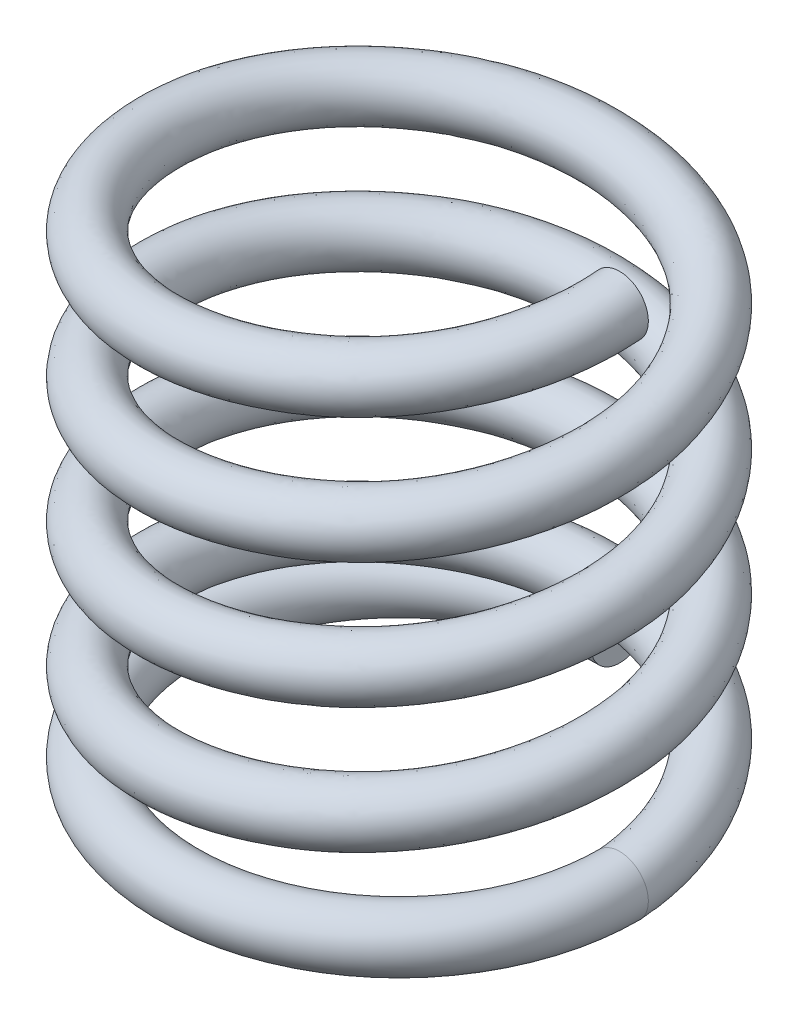
ISO-10303-21;
HEADER;
FILE_DESCRIPTION(('STEP AP214'),'2;1');
FILE_NAME('part.step','',(''),(''),'','','');
FILE_SCHEMA(('AUTOMOTIVE_DESIGN { 1 0 10303 214 1 1 1 1 }'));
ENDSEC;
DATA;
#1=APPLICATION_CONTEXT('core data for automotive mechanical design processes');
#2=APPLICATION_PROTOCOL_DEFINITION('international standard','automotive_design',2000,#1);
#3=PRODUCT_CONTEXT('',#1,'mechanical');
#4=PRODUCT('Part','Part','',(#3));
#5=PRODUCT_RELATED_PRODUCT_CATEGORY('part','',(#4));
#6=PRODUCT_DEFINITION_FORMATION('','',#4);
#7=PRODUCT_DEFINITION_CONTEXT('part definition',#1,'design');
#8=PRODUCT_DEFINITION('design','',#6,#7);
#9=PRODUCT_DEFINITION_SHAPE('','',#8);
#10=(LENGTH_UNIT() NAMED_UNIT(*) SI_UNIT(.MILLI.,.METRE.));
#11=(NAMED_UNIT(*) PLANE_ANGLE_UNIT() SI_UNIT($,.RADIAN.));
#12=(NAMED_UNIT(*) SI_UNIT($,.STERADIAN.) SOLID_ANGLE_UNIT());
#13=UNCERTAINTY_MEASURE_WITH_UNIT(LENGTH_MEASURE(1.E-05),#10,'distance_accuracy_value','');
#14=(GEOMETRIC_REPRESENTATION_CONTEXT(3) GLOBAL_UNCERTAINTY_ASSIGNED_CONTEXT((#13)) GLOBAL_UNIT_ASSIGNED_CONTEXT((#10,
#11,#12)) REPRESENTATION_CONTEXT('',''));
#15=CARTESIAN_POINT('',(0.,0.,0.));
#16=DIRECTION('',(0.,0.,1.));
#17=DIRECTION('',(1.,0.,0.));
#18=AXIS2_PLACEMENT_3D('',#15,#16,#17);
#19=CARTESIAN_POINT('',(3.302,0.,0.));
#20=CARTESIAN_POINT('',(3.302,0.138586516549963,-1.90641058886414));
#21=CARTESIAN_POINT('',(1.651,0.277173033099925,-2.85961588329622));
#22=CARTESIAN_POINT('',(0.,0.415759549649887,-3.81282117772829));
#23=CARTESIAN_POINT('',(-1.651,0.55434606619985,-2.85961588329622));
#24=CARTESIAN_POINT('',(-3.302,0.692932582749813,-1.90641058886415));
#25=CARTESIAN_POINT('',(-3.302,0.831519099299775,0.));
#26=CARTESIAN_POINT('',(-3.302,0.970105615849738,1.90641058886414));
#27=CARTESIAN_POINT('',(-1.651,1.1086921323997,2.85961588329622));
#28=CARTESIAN_POINT('',(0.,1.24727864894966,3.81282117772829));
#29=CARTESIAN_POINT('',(1.651,1.38586516549963,2.85961588329622));
#30=CARTESIAN_POINT('',(3.302,1.52445168204959,1.90641058886415));
#31=CARTESIAN_POINT('',(3.302,1.66303819859955,0.));
#32=CARTESIAN_POINT('',(3.302,1.80162471514951,-1.90641058886414));
#33=CARTESIAN_POINT('',(1.651,1.94021123169948,-2.85961588329622));
#34=CARTESIAN_POINT('',(0.,2.07879774824944,-3.81282117772829));
#35=CARTESIAN_POINT('',(-1.651,2.2173842647994,-2.85961588329622));
#36=CARTESIAN_POINT('',(-3.302,2.35597078134936,-1.90641058886415));
#37=CARTESIAN_POINT('',(-3.302,2.49455729789933,0.));
#38=CARTESIAN_POINT('',(-3.302,2.63314381444929,1.90641058886414));
#39=CARTESIAN_POINT('',(-1.651,2.77173033099925,2.85961588329622));
#40=CARTESIAN_POINT('',(0.,2.91031684754921,3.81282117772829));
#41=CARTESIAN_POINT('',(1.651,3.04890336409918,2.85961588329622));
#42=CARTESIAN_POINT('',(3.302,3.18748988064914,1.90641058886415));
#43=CARTESIAN_POINT('',(3.302,3.3260763971991,0.));
#44=CARTESIAN_POINT('',(3.302,3.46466291374906,-1.90641058886414));
#45=CARTESIAN_POINT('',(1.651,3.60324943029902,-2.85961588329622));
#46=CARTESIAN_POINT('',(0.,3.74183594684899,-3.81282117772829));
#47=CARTESIAN_POINT('',(-1.651,3.88042246339895,-2.85961588329622));
#48=CARTESIAN_POINT('',(-3.302,4.01900897994891,-1.90641058886415));
#49=CARTESIAN_POINT('',(-3.302,4.15759549649887,0.));
#50=CARTESIAN_POINT('',(-3.302,4.29618201304884,1.90641058886414));
#51=CARTESIAN_POINT('',(-1.651,4.4347685295988,2.85961588329622));
#52=CARTESIAN_POINT('',(0.,4.57335504614876,3.81282117772829));
#53=CARTESIAN_POINT('',(1.651,4.71194156269873,2.85961588329622));
#54=CARTESIAN_POINT('',(3.302,4.85052807924869,1.90641058886415));
#55=CARTESIAN_POINT('',(3.302,4.98911459579865,0.));
#56=CARTESIAN_POINT('',(3.302,5.12770111234861,-1.90641058886414));
#57=CARTESIAN_POINT('',(1.651,5.26628762889858,-2.85961588329622));
#58=CARTESIAN_POINT('',(0.,5.40487414544854,-3.81282117772829));
#59=CARTESIAN_POINT('',(-1.651,5.5434606619985,-2.85961588329622));
#60=CARTESIAN_POINT('',(-3.302,5.68204717854846,-1.90641058886415));
#61=CARTESIAN_POINT('',(-3.302,5.82063369509842,0.));
#62=CARTESIAN_POINT('',(-3.302,5.95922021164839,1.90641058886414));
#63=CARTESIAN_POINT('',(-1.651,6.09780672819835,2.85961588329622));
#64=CARTESIAN_POINT('',(0.,6.23639324474831,3.81282117772829));
#65=CARTESIAN_POINT('',(1.651,6.37497976129828,2.85961588329622));
#66=CARTESIAN_POINT('',(3.302,6.51356627784824,1.90641058886415));
#67=CARTESIAN_POINT('',(3.302,6.6521527943982,0.));
#68=CARTESIAN_POINT('',(3.302,0.761999999999999,0.));
#69=CARTESIAN_POINT('',(3.302,0.900586516549962,-1.90641058886414));
#70=CARTESIAN_POINT('',(1.651,1.03917303309992,-2.85961588329622));
#71=CARTESIAN_POINT('',(0.,1.17775954964989,-3.81282117772829));
#72=CARTESIAN_POINT('',(-1.651,1.31634606619985,-2.85961588329622));
#73=CARTESIAN_POINT('',(-3.302,1.45493258274981,-1.90641058886415));
#74=CARTESIAN_POINT('',(-3.302,1.59351909929977,0.));
#75=CARTESIAN_POINT('',(-3.302,1.73210561584974,1.90641058886414));
#76=CARTESIAN_POINT('',(-1.651,1.8706921323997,2.85961588329622));
#77=CARTESIAN_POINT('',(0.,2.00927864894966,3.81282117772829));
#78=CARTESIAN_POINT('',(1.651,2.14786516549962,2.85961588329622));
#79=CARTESIAN_POINT('',(3.302,2.28645168204959,1.90641058886415));
#80=CARTESIAN_POINT('',(3.302,2.42503819859955,0.));
#81=CARTESIAN_POINT('',(3.302,2.56362471514951,-1.90641058886414));
#82=CARTESIAN_POINT('',(1.651,2.70221123169947,-2.85961588329622));
#83=CARTESIAN_POINT('',(0.,2.84079774824944,-3.81282117772829));
#84=CARTESIAN_POINT('',(-1.651,2.9793842647994,-2.85961588329622));
#85=CARTESIAN_POINT('',(-3.302,3.11797078134936,-1.90641058886415));
#86=CARTESIAN_POINT('',(-3.302,3.25655729789932,0.));
#87=CARTESIAN_POINT('',(-3.302,3.39514381444929,1.90641058886414));
#88=CARTESIAN_POINT('',(-1.651,3.53373033099925,2.85961588329622));
#89=CARTESIAN_POINT('',(0.,3.67231684754921,3.81282117772829));
#90=CARTESIAN_POINT('',(1.651,3.81090336409917,2.85961588329622));
#91=CARTESIAN_POINT('',(3.302,3.94948988064914,1.90641058886415));
#92=CARTESIAN_POINT('',(3.302,4.0880763971991,0.));
#93=CARTESIAN_POINT('',(3.302,4.22666291374906,-1.90641058886414));
#94=CARTESIAN_POINT('',(1.651,4.36524943029902,-2.85961588329622));
#95=CARTESIAN_POINT('',(0.,4.50383594684899,-3.81282117772829));
#96=CARTESIAN_POINT('',(-1.651,4.64242246339895,-2.85961588329622));
#97=CARTESIAN_POINT('',(-3.302,4.78100897994891,-1.90641058886415));
#98=CARTESIAN_POINT('',(-3.302,4.91959549649888,0.));
#99=CARTESIAN_POINT('',(-3.302,5.05818201304884,1.90641058886414));
#100=CARTESIAN_POINT('',(-1.651,5.1967685295988,2.85961588329622));
#101=CARTESIAN_POINT('',(0.,5.33535504614876,3.81282117772829));
#102=CARTESIAN_POINT('',(1.651,5.47394156269872,2.85961588329622));
#103=CARTESIAN_POINT('',(3.302,5.61252807924869,1.90641058886415));
#104=CARTESIAN_POINT('',(3.302,5.75111459579865,0.));
#105=CARTESIAN_POINT('',(3.302,5.88970111234861,-1.90641058886414));
#106=CARTESIAN_POINT('',(1.651,6.02828762889857,-2.85961588329622));
#107=CARTESIAN_POINT('',(0.,6.16687414544854,-3.81282117772829));
#108=CARTESIAN_POINT('',(-1.651,6.3054606619985,-2.85961588329622));
#109=CARTESIAN_POINT('',(-3.302,6.44404717854846,-1.90641058886415));
#110=CARTESIAN_POINT('',(-3.302,6.58263369509843,0.));
#111=CARTESIAN_POINT('',(-3.302,6.72122021164839,1.90641058886414));
#112=CARTESIAN_POINT('',(-1.651,6.85980672819835,2.85961588329622));
#113=CARTESIAN_POINT('',(0.,6.99839324474831,3.81282117772829));
#114=CARTESIAN_POINT('',(1.651,7.13697976129828,2.85961588329622));
#115=CARTESIAN_POINT('',(3.302,7.27556627784824,1.90641058886415));
#116=CARTESIAN_POINT('',(3.302,7.4141527943982,0.));
#117=CARTESIAN_POINT('',(2.54,0.761999999999999,0.));
#118=CARTESIAN_POINT('',(2.54,0.900586516549962,-1.46646968374165));
#119=CARTESIAN_POINT('',(1.27,1.03917303309992,-2.19970452561247));
#120=CARTESIAN_POINT('',(0.,1.17775954964989,-2.9329393674833));
#121=CARTESIAN_POINT('',(-1.27,1.31634606619985,-2.19970452561247));
#122=CARTESIAN_POINT('',(-2.54,1.45493258274981,-1.46646968374165));
#123=CARTESIAN_POINT('',(-2.54,1.59351909929977,0.));
#124=CARTESIAN_POINT('',(-2.54,1.73210561584974,1.46646968374165));
#125=CARTESIAN_POINT('',(-1.27,1.8706921323997,2.19970452561247));
#126=CARTESIAN_POINT('',(0.,2.00927864894966,2.9329393674833));
#127=CARTESIAN_POINT('',(1.27,2.14786516549962,2.19970452561248));
#128=CARTESIAN_POINT('',(2.54,2.28645168204959,1.46646968374165));
#129=CARTESIAN_POINT('',(2.54,2.42503819859955,0.));
#130=CARTESIAN_POINT('',(2.54,2.56362471514951,-1.46646968374165));
#131=CARTESIAN_POINT('',(1.27,2.70221123169947,-2.19970452561247));
#132=CARTESIAN_POINT('',(0.,2.84079774824944,-2.9329393674833));
#133=CARTESIAN_POINT('',(-1.27,2.9793842647994,-2.19970452561247));
#134=CARTESIAN_POINT('',(-2.54,3.11797078134936,-1.46646968374165));
#135=CARTESIAN_POINT('',(-2.54,3.25655729789932,0.));
#136=CARTESIAN_POINT('',(-2.54,3.39514381444929,1.46646968374165));
#137=CARTESIAN_POINT('',(-1.27,3.53373033099925,2.19970452561247));
#138=CARTESIAN_POINT('',(0.,3.67231684754921,2.9329393674833));
#139=CARTESIAN_POINT('',(1.27,3.81090336409917,2.19970452561248));
#140=CARTESIAN_POINT('',(2.54,3.94948988064914,1.46646968374165));
#141=CARTESIAN_POINT('',(2.54,4.0880763971991,0.));
#142=CARTESIAN_POINT('',(2.54,4.22666291374906,-1.46646968374165));
#143=CARTESIAN_POINT('',(1.27,4.36524943029902,-2.19970452561247));
#144=CARTESIAN_POINT('',(0.,4.50383594684899,-2.9329393674833));
#145=CARTESIAN_POINT('',(-1.27,4.64242246339895,-2.19970452561247));
#146=CARTESIAN_POINT('',(-2.54,4.78100897994891,-1.46646968374165));
#147=CARTESIAN_POINT('',(-2.54,4.91959549649888,0.));
#148=CARTESIAN_POINT('',(-2.54,5.05818201304884,1.46646968374165));
#149=CARTESIAN_POINT('',(-1.27,5.1967685295988,2.19970452561247));
#150=CARTESIAN_POINT('',(0.,5.33535504614876,2.9329393674833));
#151=CARTESIAN_POINT('',(1.27,5.47394156269872,2.19970452561248));
#152=CARTESIAN_POINT('',(2.54,5.61252807924869,1.46646968374165));
#153=CARTESIAN_POINT('',(2.54,5.75111459579865,0.));
#154=CARTESIAN_POINT('',(2.54,5.88970111234861,-1.46646968374165));
#155=CARTESIAN_POINT('',(1.27,6.02828762889857,-2.19970452561247));
#156=CARTESIAN_POINT('',(0.,6.16687414544854,-2.9329393674833));
#157=CARTESIAN_POINT('',(-1.27,6.3054606619985,-2.19970452561247));
#158=CARTESIAN_POINT('',(-2.54,6.44404717854846,-1.46646968374165));
#159=CARTESIAN_POINT('',(-2.54,6.58263369509843,0.));
#160=CARTESIAN_POINT('',(-2.54,6.72122021164839,1.46646968374165));
#161=CARTESIAN_POINT('',(-1.27,6.85980672819835,2.19970452561247));
#162=CARTESIAN_POINT('',(0.,6.99839324474831,2.9329393674833));
#163=CARTESIAN_POINT('',(1.27,7.13697976129828,2.19970452561248));
#164=CARTESIAN_POINT('',(2.54,7.27556627784824,1.46646968374165));
#165=CARTESIAN_POINT('',(2.54,7.4141527943982,0.));
#166=CARTESIAN_POINT('',(2.54,0.,0.));
#167=CARTESIAN_POINT('',(2.54,0.138586516549963,-1.46646968374165));
#168=CARTESIAN_POINT('',(1.27,0.277173033099925,-2.19970452561247));
#169=CARTESIAN_POINT('',(0.,0.415759549649888,-2.9329393674833));
#170=CARTESIAN_POINT('',(-1.27,0.55434606619985,-2.19970452561247));
#171=CARTESIAN_POINT('',(-2.54,0.692932582749813,-1.46646968374165));
#172=CARTESIAN_POINT('',(-2.54,0.831519099299775,0.));
#173=CARTESIAN_POINT('',(-2.54,0.970105615849738,1.46646968374165));
#174=CARTESIAN_POINT('',(-1.27,1.1086921323997,2.19970452561247));
#175=CARTESIAN_POINT('',(0.,1.24727864894966,2.9329393674833));
#176=CARTESIAN_POINT('',(1.27,1.38586516549963,2.19970452561248));
#177=CARTESIAN_POINT('',(2.54,1.52445168204959,1.46646968374165));
#178=CARTESIAN_POINT('',(2.54,1.66303819859955,0.));
#179=CARTESIAN_POINT('',(2.54,1.80162471514951,-1.46646968374165));
#180=CARTESIAN_POINT('',(1.27,1.94021123169948,-2.19970452561247));
#181=CARTESIAN_POINT('',(0.,2.07879774824944,-2.9329393674833));
#182=CARTESIAN_POINT('',(-1.27,2.2173842647994,-2.19970452561247));
#183=CARTESIAN_POINT('',(-2.54,2.35597078134936,-1.46646968374165));
#184=CARTESIAN_POINT('',(-2.54,2.49455729789933,0.));
#185=CARTESIAN_POINT('',(-2.54,2.63314381444929,1.46646968374165));
#186=CARTESIAN_POINT('',(-1.27,2.77173033099925,2.19970452561247));
#187=CARTESIAN_POINT('',(0.,2.91031684754921,2.9329393674833));
#188=CARTESIAN_POINT('',(1.27,3.04890336409918,2.19970452561248));
#189=CARTESIAN_POINT('',(2.54,3.18748988064914,1.46646968374165));
#190=CARTESIAN_POINT('',(2.54,3.3260763971991,0.));
#191=CARTESIAN_POINT('',(2.54,3.46466291374906,-1.46646968374165));
#192=CARTESIAN_POINT('',(1.27,3.60324943029902,-2.19970452561247));
#193=CARTESIAN_POINT('',(0.,3.74183594684899,-2.9329393674833));
#194=CARTESIAN_POINT('',(-1.27,3.88042246339895,-2.19970452561247));
#195=CARTESIAN_POINT('',(-2.54,4.01900897994891,-1.46646968374165));
#196=CARTESIAN_POINT('',(-2.54,4.15759549649887,0.));
#197=CARTESIAN_POINT('',(-2.54,4.29618201304884,1.46646968374165));
#198=CARTESIAN_POINT('',(-1.27,4.4347685295988,2.19970452561247));
#199=CARTESIAN_POINT('',(0.,4.57335504614876,2.9329393674833));
#200=CARTESIAN_POINT('',(1.27,4.71194156269873,2.19970452561248));
#201=CARTESIAN_POINT('',(2.54,4.85052807924869,1.46646968374165));
#202=CARTESIAN_POINT('',(2.54,4.98911459579865,0.));
#203=CARTESIAN_POINT('',(2.54,5.12770111234861,-1.46646968374165));
#204=CARTESIAN_POINT('',(1.27,5.26628762889858,-2.19970452561247));
#205=CARTESIAN_POINT('',(0.,5.40487414544854,-2.9329393674833));
#206=CARTESIAN_POINT('',(-1.27,5.5434606619985,-2.19970452561247));
#207=CARTESIAN_POINT('',(-2.54,5.68204717854846,-1.46646968374165));
#208=CARTESIAN_POINT('',(-2.54,5.82063369509842,0.));
#209=CARTESIAN_POINT('',(-2.54,5.95922021164839,1.46646968374165));
#210=CARTESIAN_POINT('',(-1.27,6.09780672819835,2.19970452561247));
#211=CARTESIAN_POINT('',(0.,6.23639324474831,2.9329393674833));
#212=CARTESIAN_POINT('',(1.27,6.37497976129828,2.19970452561248));
#213=CARTESIAN_POINT('',(2.54,6.51356627784824,1.46646968374165));
#214=CARTESIAN_POINT('',(2.54,6.6521527943982,0.));
#215=CARTESIAN_POINT('',(2.54,-0.761999999999999,0.));
#216=CARTESIAN_POINT('',(2.54,-0.623413483450037,-1.46646968374165));
#217=CARTESIAN_POINT('',(1.27,-0.484826966900074,-2.19970452561247));
#218=CARTESIAN_POINT('',(0.,-0.346240450350112,-2.9329393674833));
#219=CARTESIAN_POINT('',(-1.27,-0.207653933800149,-2.19970452561247));
#220=CARTESIAN_POINT('',(-2.54,-0.0690674172501869,-1.46646968374165));
#221=CARTESIAN_POINT('',(-2.54,0.0695190992997755,0.));
#222=CARTESIAN_POINT('',(-2.54,0.208105615849738,1.46646968374165));
#223=CARTESIAN_POINT('',(-1.27,0.346692132399701,2.19970452561247));
#224=CARTESIAN_POINT('',(0.,0.485278648949663,2.9329393674833));
#225=CARTESIAN_POINT('',(1.27,0.623865165499626,2.19970452561248));
#226=CARTESIAN_POINT('',(2.54,0.762451682049588,1.46646968374165));
#227=CARTESIAN_POINT('',(2.54,0.90103819859955,0.));
#228=CARTESIAN_POINT('',(2.54,1.03962471514951,-1.46646968374165));
#229=CARTESIAN_POINT('',(1.27,1.17821123169948,-2.19970452561247));
#230=CARTESIAN_POINT('',(0.,1.31679774824944,-2.9329393674833));
#231=CARTESIAN_POINT('',(-1.27,1.4553842647994,-2.19970452561247));
#232=CARTESIAN_POINT('',(-2.54,1.59397078134936,-1.46646968374165));
#233=CARTESIAN_POINT('',(-2.54,1.73255729789933,0.));
#234=CARTESIAN_POINT('',(-2.54,1.87114381444929,1.46646968374165));
#235=CARTESIAN_POINT('',(-1.27,2.00973033099925,2.19970452561247));
#236=CARTESIAN_POINT('',(0.,2.14831684754921,2.9329393674833));
#237=CARTESIAN_POINT('',(1.27,2.28690336409918,2.19970452561248));
#238=CARTESIAN_POINT('',(2.54,2.42548988064914,1.46646968374165));
#239=CARTESIAN_POINT('',(2.54,2.5640763971991,0.));
#240=CARTESIAN_POINT('',(2.54,2.70266291374906,-1.46646968374165));
#241=CARTESIAN_POINT('',(1.27,2.84124943029903,-2.19970452561247));
#242=CARTESIAN_POINT('',(0.,2.97983594684899,-2.9329393674833));
#243=CARTESIAN_POINT('',(-1.27,3.11842246339895,-2.19970452561247));
#244=CARTESIAN_POINT('',(-2.54,3.25700897994891,-1.46646968374165));
#245=CARTESIAN_POINT('',(-2.54,3.39559549649888,0.));
#246=CARTESIAN_POINT('',(-2.54,3.53418201304884,1.46646968374165));
#247=CARTESIAN_POINT('',(-1.27,3.6727685295988,2.19970452561247));
#248=CARTESIAN_POINT('',(0.,3.81135504614876,2.9329393674833));
#249=CARTESIAN_POINT('',(1.27,3.94994156269873,2.19970452561248));
#250=CARTESIAN_POINT('',(2.54,4.08852807924869,1.46646968374165));
#251=CARTESIAN_POINT('',(2.54,4.22711459579865,0.));
#252=CARTESIAN_POINT('',(2.54,4.36570111234861,-1.46646968374165));
#253=CARTESIAN_POINT('',(1.27,4.50428762889858,-2.19970452561247));
#254=CARTESIAN_POINT('',(0.,4.64287414544854,-2.9329393674833));
#255=CARTESIAN_POINT('',(-1.27,4.7814606619985,-2.19970452561247));
#256=CARTESIAN_POINT('',(-2.54,4.92004717854846,-1.46646968374165));
#257=CARTESIAN_POINT('',(-2.54,5.05863369509843,0.));
#258=CARTESIAN_POINT('',(-2.54,5.19722021164839,1.46646968374165));
#259=CARTESIAN_POINT('',(-1.27,5.33580672819835,2.19970452561247));
#260=CARTESIAN_POINT('',(0.,5.47439324474831,2.9329393674833));
#261=CARTESIAN_POINT('',(1.27,5.61297976129828,2.19970452561248));
#262=CARTESIAN_POINT('',(2.54,5.75156627784824,1.46646968374165));
#263=CARTESIAN_POINT('',(2.54,5.8901527943982,0.));
#264=CARTESIAN_POINT('',(3.302,-0.761999999999999,0.));
#265=CARTESIAN_POINT('',(3.302,-0.623413483450037,-1.90641058886414));
#266=CARTESIAN_POINT('',(1.651,-0.484826966900074,-2.85961588329622));
#267=CARTESIAN_POINT('',(0.,-0.346240450350112,-3.81282117772829));
#268=CARTESIAN_POINT('',(-1.651,-0.207653933800149,-2.85961588329622));
#269=CARTESIAN_POINT('',(-3.302,-0.0690674172501869,-1.90641058886415));
#270=CARTESIAN_POINT('',(-3.302,0.0695190992997755,0.));
#271=CARTESIAN_POINT('',(-3.302,0.208105615849738,1.90641058886414));
#272=CARTESIAN_POINT('',(-1.651,0.346692132399701,2.85961588329622));
#273=CARTESIAN_POINT('',(0.,0.485278648949663,3.81282117772829));
#274=CARTESIAN_POINT('',(1.651,0.623865165499626,2.85961588329622));
#275=CARTESIAN_POINT('',(3.302,0.762451682049588,1.90641058886415));
#276=CARTESIAN_POINT('',(3.302,0.90103819859955,0.));
#277=CARTESIAN_POINT('',(3.302,1.03962471514951,-1.90641058886414));
#278=CARTESIAN_POINT('',(1.651,1.17821123169948,-2.85961588329622));
#279=CARTESIAN_POINT('',(0.,1.31679774824944,-3.81282117772829));
#280=CARTESIAN_POINT('',(-1.651,1.4553842647994,-2.85961588329622));
#281=CARTESIAN_POINT('',(-3.302,1.59397078134936,-1.90641058886415));
#282=CARTESIAN_POINT('',(-3.302,1.73255729789933,0.));
#283=CARTESIAN_POINT('',(-3.302,1.87114381444929,1.90641058886414));
#284=CARTESIAN_POINT('',(-1.651,2.00973033099925,2.85961588329622));
#285=CARTESIAN_POINT('',(0.,2.14831684754921,3.81282117772829));
#286=CARTESIAN_POINT('',(1.651,2.28690336409918,2.85961588329622));
#287=CARTESIAN_POINT('',(3.302,2.42548988064914,1.90641058886415));
#288=CARTESIAN_POINT('',(3.302,2.5640763971991,0.));
#289=CARTESIAN_POINT('',(3.302,2.70266291374906,-1.90641058886414));
#290=CARTESIAN_POINT('',(1.651,2.84124943029903,-2.85961588329622));
#291=CARTESIAN_POINT('',(0.,2.97983594684899,-3.81282117772829));
#292=CARTESIAN_POINT('',(-1.651,3.11842246339895,-2.85961588329622));
#293=CARTESIAN_POINT('',(-3.302,3.25700897994891,-1.90641058886415));
#294=CARTESIAN_POINT('',(-3.302,3.39559549649888,0.));
#295=CARTESIAN_POINT('',(-3.302,3.53418201304884,1.90641058886414));
#296=CARTESIAN_POINT('',(-1.651,3.6727685295988,2.85961588329622));
#297=CARTESIAN_POINT('',(0.,3.81135504614876,3.81282117772829));
#298=CARTESIAN_POINT('',(1.651,3.94994156269873,2.85961588329622));
#299=CARTESIAN_POINT('',(3.302,4.08852807924869,1.90641058886415));
#300=CARTESIAN_POINT('',(3.302,4.22711459579865,0.));
#301=CARTESIAN_POINT('',(3.302,4.36570111234861,-1.90641058886414));
#302=CARTESIAN_POINT('',(1.651,4.50428762889858,-2.85961588329622));
#303=CARTESIAN_POINT('',(0.,4.64287414544854,-3.81282117772829));
#304=CARTESIAN_POINT('',(-1.651,4.7814606619985,-2.85961588329622));
#305=CARTESIAN_POINT('',(-3.302,4.92004717854846,-1.90641058886415));
#306=CARTESIAN_POINT('',(-3.302,5.05863369509843,0.));
#307=CARTESIAN_POINT('',(-3.302,5.19722021164839,1.90641058886414));
#308=CARTESIAN_POINT('',(-1.651,5.33580672819835,2.85961588329622));
#309=CARTESIAN_POINT('',(0.,5.47439324474831,3.81282117772829));
#310=CARTESIAN_POINT('',(1.651,5.61297976129828,2.85961588329622));
#311=CARTESIAN_POINT('',(3.302,5.75156627784824,1.90641058886415));
#312=CARTESIAN_POINT('',(3.302,5.8901527943982,0.));
#313=CARTESIAN_POINT('',(3.302,0.,0.));
#314=CARTESIAN_POINT('',(3.302,0.138586516549963,-1.90641058886414));
#315=CARTESIAN_POINT('',(1.651,0.277173033099925,-2.85961588329622));
#316=CARTESIAN_POINT('',(0.,0.415759549649887,-3.81282117772829));
#317=CARTESIAN_POINT('',(-1.651,0.55434606619985,-2.85961588329622));
#318=CARTESIAN_POINT('',(-3.302,0.692932582749813,-1.90641058886415));
#319=CARTESIAN_POINT('',(-3.302,0.831519099299775,0.));
#320=CARTESIAN_POINT('',(-3.302,0.970105615849738,1.90641058886414));
#321=CARTESIAN_POINT('',(-1.651,1.1086921323997,2.85961588329622));
#322=CARTESIAN_POINT('',(0.,1.24727864894966,3.81282117772829));
#323=CARTESIAN_POINT('',(1.651,1.38586516549963,2.85961588329622));
#324=CARTESIAN_POINT('',(3.302,1.52445168204959,1.90641058886415));
#325=CARTESIAN_POINT('',(3.302,1.66303819859955,0.));
#326=CARTESIAN_POINT('',(3.302,1.80162471514951,-1.90641058886414));
#327=CARTESIAN_POINT('',(1.651,1.94021123169948,-2.85961588329622));
#328=CARTESIAN_POINT('',(0.,2.07879774824944,-3.81282117772829));
#329=CARTESIAN_POINT('',(-1.651,2.2173842647994,-2.85961588329622));
#330=CARTESIAN_POINT('',(-3.302,2.35597078134936,-1.90641058886415));
#331=CARTESIAN_POINT('',(-3.302,2.49455729789933,0.));
#332=CARTESIAN_POINT('',(-3.302,2.63314381444929,1.90641058886414));
#333=CARTESIAN_POINT('',(-1.651,2.77173033099925,2.85961588329622));
#334=CARTESIAN_POINT('',(0.,2.91031684754921,3.81282117772829));
#335=CARTESIAN_POINT('',(1.651,3.04890336409918,2.85961588329622));
#336=CARTESIAN_POINT('',(3.302,3.18748988064914,1.90641058886415));
#337=CARTESIAN_POINT('',(3.302,3.3260763971991,0.));
#338=CARTESIAN_POINT('',(3.302,3.46466291374906,-1.90641058886414));
#339=CARTESIAN_POINT('',(1.651,3.60324943029902,-2.85961588329622));
#340=CARTESIAN_POINT('',(0.,3.74183594684899,-3.81282117772829));
#341=CARTESIAN_POINT('',(-1.651,3.88042246339895,-2.85961588329622));
#342=CARTESIAN_POINT('',(-3.302,4.01900897994891,-1.90641058886415));
#343=CARTESIAN_POINT('',(-3.302,4.15759549649887,0.));
#344=CARTESIAN_POINT('',(-3.302,4.29618201304884,1.90641058886414));
#345=CARTESIAN_POINT('',(-1.651,4.4347685295988,2.85961588329622));
#346=CARTESIAN_POINT('',(0.,4.57335504614876,3.81282117772829));
#347=CARTESIAN_POINT('',(1.651,4.71194156269873,2.85961588329622));
#348=CARTESIAN_POINT('',(3.302,4.85052807924869,1.90641058886415));
#349=CARTESIAN_POINT('',(3.302,4.98911459579865,0.));
#350=CARTESIAN_POINT('',(3.302,5.12770111234861,-1.90641058886414));
#351=CARTESIAN_POINT('',(1.651,5.26628762889858,-2.85961588329622));
#352=CARTESIAN_POINT('',(0.,5.40487414544854,-3.81282117772829));
#353=CARTESIAN_POINT('',(-1.651,5.5434606619985,-2.85961588329622));
#354=CARTESIAN_POINT('',(-3.302,5.68204717854846,-1.90641058886415));
#355=CARTESIAN_POINT('',(-3.302,5.82063369509842,0.));
#356=CARTESIAN_POINT('',(-3.302,5.95922021164839,1.90641058886414));
#357=CARTESIAN_POINT('',(-1.651,6.09780672819835,2.85961588329622));
#358=CARTESIAN_POINT('',(0.,6.23639324474831,3.81282117772829));
#359=CARTESIAN_POINT('',(1.651,6.37497976129828,2.85961588329622));
#360=CARTESIAN_POINT('',(3.302,6.51356627784824,1.90641058886415));
#361=CARTESIAN_POINT('',(3.302,6.6521527943982,0.));
#362=(BOUNDED_SURFACE() B_SPLINE_SURFACE(3,2,((#19,#20,#21,#22,#23,#24,#25,#26,#27,#28,#29,#30,
#31,#32,#33,#34,#35,#36,#37,#38,#39,#40,#41,#42,#43,#44,#45,#46,#47,#48,#49,#50,#51,#52,#53,#54,
#55,#56,#57,#58,#59,#60,#61,#62,#63,#64,#65,#66,#67),(#68,#69,#70,#71,#72,#73,#74,#75,#76,#77,
#78,#79,#80,#81,#82,#83,#84,#85,#86,#87,#88,#89,#90,#91,#92,#93,#94,#95,#96,#97,#98,#99,#100,
#101,#102,#103,#104,#105,#106,#107,#108,#109,#110,#111,#112,#113,#114,#115,#116),(#117,#118,
#119,#120,#121,#122,#123,#124,#125,#126,#127,#128,#129,#130,#131,#132,#133,#134,#135,#136,#137,
#138,#139,#140,#141,#142,#143,#144,#145,#146,#147,#148,#149,#150,#151,#152,#153,#154,#155,#156,
#157,#158,#159,#160,#161,#162,#163,#164,#165),(#166,#167,#168,#169,#170,#171,#172,#173,#174,
#175,#176,#177,#178,#179,#180,#181,#182,#183,#184,#185,#186,#187,#188,#189,#190,#191,#192,#193,
#194,#195,#196,#197,#198,#199,#200,#201,#202,#203,#204,#205,#206,#207,#208,#209,#210,#211,#212,
#213,#214),(#215,#216,#217,#218,#219,#220,#221,#222,#223,#224,#225,#226,#227,#228,#229,#230,
#231,#232,#233,#234,#235,#236,#237,#238,#239,#240,#241,#242,#243,#244,#245,#246,#247,#248,#249,
#250,#251,#252,#253,#254,#255,#256,#257,#258,#259,#260,#261,#262,#263),(#264,#265,#266,#267,
#268,#269,#270,#271,#272,#273,#274,#275,#276,#277,#278,#279,#280,#281,#282,#283,#284,#285,#286,
#287,#288,#289,#290,#291,#292,#293,#294,#295,#296,#297,#298,#299,#300,#301,#302,#303,#304,#305,
#306,#307,#308,#309,#310,#311,#312),(#313,#314,#315,#316,#317,#318,#319,#320,#321,#322,#323,
#324,#325,#326,#327,#328,#329,#330,#331,#332,#333,#334,#335,#336,#337,#338,#339,#340,#341,#342,
#343,#344,#345,#346,#347,#348,#349,#350,#351,#352,#353,#354,#355,#356,#357,#358,#359,#360,
#361)),.UNSPECIFIED.,.T.,.F.,.F.) B_SPLINE_SURFACE_WITH_KNOTS((4,3,4),(3,2,2,2,2,2,2,2,2,2,2,2,
2,2,2,2,2,2,2,2,2,2,2,2,3),(0.,0.5,1.),(0.,0.0416666666666667,0.0833333333333333,0.125,
0.166666666666667,0.208333333333333,0.25,0.291666666666667,0.333333333333333,0.375,
0.416666666666667,0.458333333333333,0.5,0.541666666666667,0.583333333333333,0.625,
0.666666666666667,0.708333333333333,0.75,0.791666666666667,0.833333333333333,0.875,
0.916666666666667,0.958333333333333,1.),
.UNSPECIFIED.) GEOMETRIC_REPRESENTATION_ITEM() RATIONAL_B_SPLINE_SURFACE(((1.,0.866025403784439,
1.,0.866025403784439,1.,0.866025403784439,1.,0.866025403784439,1.,0.866025403784439,1.,
0.866025403784439,1.,0.866025403784439,1.,0.866025403784439,1.,0.866025403784439,1.,
0.866025403784439,1.,0.866025403784439,1.,0.866025403784439,1.,0.866025403784439,1.,
0.866025403784439,1.,0.866025403784439,1.,0.866025403784439,1.,0.866025403784439,1.,
0.866025403784439,1.,0.866025403784439,1.,0.866025403784439,1.,0.866025403784439,1.,
0.866025403784439,1.,0.866025403784439,1.,0.866025403784439,1.),(0.333333333333333,
0.288675134594813,0.333333333333333,0.288675134594813,0.333333333333333,0.288675134594813,
0.333333333333333,0.288675134594813,0.333333333333333,0.288675134594813,0.333333333333333,
0.288675134594813,0.333333333333333,0.288675134594813,0.333333333333333,0.288675134594813,
0.333333333333333,0.288675134594813,0.333333333333333,0.288675134594813,0.333333333333333,
0.288675134594813,0.333333333333333,0.288675134594813,0.333333333333333,0.288675134594813,
0.333333333333333,0.288675134594813,0.333333333333333,0.288675134594813,0.333333333333333,
0.288675134594813,0.333333333333333,0.288675134594813,0.333333333333333,0.288675134594813,
0.333333333333333,0.288675134594813,0.333333333333333,0.288675134594813,0.333333333333333,
0.288675134594813,0.333333333333333,0.288675134594813,0.333333333333333,0.288675134594813,
0.333333333333333,0.288675134594813,0.333333333333333),(0.333333333333333,0.288675134594813,
0.333333333333333,0.288675134594813,0.333333333333333,0.288675134594813,0.333333333333333,
0.288675134594813,0.333333333333333,0.288675134594813,0.333333333333333,0.288675134594813,
0.333333333333333,0.288675134594813,0.333333333333333,0.288675134594813,0.333333333333333,
0.288675134594813,0.333333333333333,0.288675134594813,0.333333333333333,0.288675134594813,
0.333333333333333,0.288675134594813,0.333333333333333,0.288675134594813,0.333333333333333,
0.288675134594813,0.333333333333333,0.288675134594813,0.333333333333333,0.288675134594813,
0.333333333333333,0.288675134594813,0.333333333333333,0.288675134594813,0.333333333333333,
0.288675134594813,0.333333333333333,0.288675134594813,0.333333333333333,0.288675134594813,
0.333333333333333,0.288675134594813,0.333333333333333,0.288675134594813,0.333333333333333,
0.288675134594813,0.333333333333333),(1.,0.866025403784439,1.,0.866025403784439,1.,
0.866025403784439,1.,0.866025403784439,1.,0.866025403784439,1.,0.866025403784439,1.,
0.866025403784439,1.,0.866025403784439,1.,0.866025403784439,1.,0.866025403784439,1.,
0.866025403784439,1.,0.866025403784439,1.,0.866025403784439,1.,0.866025403784439,1.,
0.866025403784439,1.,0.866025403784439,1.,0.866025403784439,1.,0.866025403784439,1.,
0.866025403784439,1.,0.866025403784439,1.,0.866025403784439,1.,0.866025403784439,1.,
0.866025403784439,1.,0.866025403784439,1.),(0.333333333333333,0.288675134594813,
0.333333333333333,0.288675134594813,0.333333333333333,0.288675134594813,0.333333333333333,
0.288675134594813,0.333333333333333,0.288675134594813,0.333333333333333,0.288675134594813,
0.333333333333333,0.288675134594813,0.333333333333333,0.288675134594813,0.333333333333333,
0.288675134594813,0.333333333333333,0.288675134594813,0.333333333333333,0.288675134594813,
0.333333333333333,0.288675134594813,0.333333333333333,0.288675134594813,0.333333333333333,
0.288675134594813,0.333333333333333,0.288675134594813,0.333333333333333,0.288675134594813,
0.333333333333333,0.288675134594813,0.333333333333333,0.288675134594813,0.333333333333333,
0.288675134594813,0.333333333333333,0.288675134594813,0.333333333333333,0.288675134594813,
0.333333333333333,0.288675134594813,0.333333333333333,0.288675134594813,0.333333333333333,
0.288675134594813,0.333333333333333),(0.333333333333333,0.288675134594813,0.333333333333333,
0.288675134594813,0.333333333333333,0.288675134594813,0.333333333333333,0.288675134594813,
0.333333333333333,0.288675134594813,0.333333333333333,0.288675134594813,0.333333333333333,
0.288675134594813,0.333333333333333,0.288675134594813,0.333333333333333,0.288675134594813,
0.333333333333333,0.288675134594813,0.333333333333333,0.288675134594813,0.333333333333333,
0.288675134594813,0.333333333333333,0.288675134594813,0.333333333333333,0.288675134594813,
0.333333333333333,0.288675134594813,0.333333333333333,0.288675134594813,0.333333333333333,
0.288675134594813,0.333333333333333,0.288675134594813,0.333333333333333,0.288675134594813,
0.333333333333333,0.288675134594813,0.333333333333333,0.288675134594813,0.333333333333333,
0.288675134594813,0.333333333333333,0.288675134594813,0.333333333333333,0.288675134594813,
0.333333333333333),(1.,0.866025403784439,1.,0.866025403784439,1.,0.866025403784439,1.,
0.866025403784439,1.,0.866025403784439,1.,0.866025403784439,1.,0.866025403784439,1.,
0.866025403784439,1.,0.866025403784439,1.,0.866025403784439,1.,0.866025403784439,1.,
0.866025403784439,1.,0.866025403784439,1.,0.866025403784439,1.,0.866025403784439,1.,
0.866025403784439,1.,0.866025403784439,1.,0.866025403784439,1.,0.866025403784439,1.,
0.866025403784439,1.,0.866025403784439,1.,0.866025403784439,1.,0.866025403784439,1.,
0.866025403784439,1.))) REPRESENTATION_ITEM('') SURFACE());
#363=CARTESIAN_POINT('',(2.921,0.,0.));
#364=DIRECTION('',(0.,0.,1.));
#365=DIRECTION('',(1.,0.,0.));
#366=AXIS2_PLACEMENT_3D('',#363,#364,#365);
#367=CIRCLE('',#366,0.381);
#368=CARTESIAN_POINT('',(3.302,0.,0.));
#369=VERTEX_POINT('',#368);
#370=EDGE_CURVE('E64',#369,#369,#367,.T.);
#371=CARTESIAN_POINT('',(2.921,6.65215279439822,-1.63177871852173E-13));
#372=DIRECTION('',(0.,0.,1.));
#373=DIRECTION('',(1.,0.,0.));
#374=AXIS2_PLACEMENT_3D('',#371,#372,#373);
#375=CIRCLE('',#374,0.381);
#376=CARTESIAN_POINT('',(3.302,6.65215279439822,-1.8446194209376E-13));
#377=VERTEX_POINT('',#376);
#378=EDGE_CURVE('E56',#377,#377,#375,.T.);
#379=CARTESIAN_POINT('',(0.,0.207879774824942,-2.60170859826996));
#380=CARTESIAN_POINT('',(-0.0639782090234916,0.2112877412724,-2.60392515885477));
#381=CARTESIAN_POINT('',(-0.12800576597512,0.214689586591613,-2.60385852118795));
#382=CARTESIAN_POINT('',(-0.255887698258032,0.22146510543133,-2.59916790343362));
#383=CARTESIAN_POINT('',(-0.319742092949768,0.224838782196984,-2.59454445582661));
#384=CARTESIAN_POINT('',(-0.509665880801416,0.234842487708618,-2.57396022778841));
#385=CARTESIAN_POINT('',(-0.635103681539535,0.241408917730544,-2.55131935585646));
#386=CARTESIAN_POINT('',(-0.819888982718583,0.251015519505359,-2.50432081134379));
#387=CARTESIAN_POINT('',(-0.880977795352207,0.254180061589678,-2.48645890701881));
#388=CARTESIAN_POINT('',(-1.00175500895194,0.260413240134104,-2.44646883016247));
#389=CARTESIAN_POINT('',(-1.06144358343394,0.263481888493069,-2.42434118940224));
#390=CARTESIAN_POINT('',(-1.17938465415755,0.269522532491548,-2.3758164955777));
#391=CARTESIAN_POINT('',(-1.23762939499288,0.272494025742196,-2.34940050449749));
#392=CARTESIAN_POINT('',(-1.32348082302878,0.276853386922257,-2.30672521955218));
#393=CARTESIAN_POINT('',(-1.35185090161395,0.278290473201148,-2.2919883059225));
#394=CARTESIAN_POINT('',(-1.40808594993877,0.281198685535813,-2.26158258849287));
#395=CARTESIAN_POINT('',(-1.43595089782817,0.28266981305786,-2.24591374450565));
#396=CARTESIAN_POINT('',(-1.53002687540853,0.287723286063958,-2.1909317759226));
#397=CARTESIAN_POINT('',(-1.59495978681425,0.291360343970814,-2.14940479026492));
#398=CARTESIAN_POINT('',(-1.72132167539064,0.298741541685375,-2.06138705658144));
#399=CARTESIAN_POINT('',(-1.7827515246988,0.302485654488631,-2.01489755239643));
#400=CARTESIAN_POINT('',(-1.90139829837257,0.31001994347785,-1.91767514837409));
#401=CARTESIAN_POINT('',(-1.95864277262261,0.313809581775065,-1.86697580542151));
#402=CARTESIAN_POINT('',(-2.06922246834528,0.321432893052864,-1.76141459487808));
#403=CARTESIAN_POINT('',(-2.12255509551625,0.325266593340333,-1.70655001314586));
#404=CARTESIAN_POINT('',(-2.21120358437098,0.331899427681073,-1.60855738277503));
#405=CARTESIAN_POINT('',(-2.24747798681383,0.334696689023746,-1.56628993235815));
#406=CARTESIAN_POINT('',(-2.31787192890023,0.340282886991754,-1.48000346050905));
#407=CARTESIAN_POINT('',(-2.35199165619301,0.343071824321811,-1.43598459215242));
#408=CARTESIAN_POINT('',(-2.41812727899564,0.348626107779124,-1.34644913480935));
#409=CARTESIAN_POINT('',(-2.45014477538961,0.351391470428987,-1.30093372605438));
#410=CARTESIAN_POINT('',(-2.49687089722687,0.355520105195016,-1.23159763616733));
#411=CARTESIAN_POINT('',(-2.51227196145205,0.356897011374185,-1.20823975975223));
#412=CARTESIAN_POINT('',(-2.54266175901986,0.359639221705602,-1.16126296333638));
#413=CARTESIAN_POINT('',(-2.55765057068757,0.361004528027195,-1.13764409413457));
#414=CARTESIAN_POINT('',(-2.58728991712322,0.363719784103342,-1.0902292596398));
#415=CARTESIAN_POINT('',(-2.60194078940854,0.365069748430288,-1.0664335054896));
#416=CARTESIAN_POINT('',(-2.63108928957528,0.367753199099754,-1.01872295893251));
#417=CARTESIAN_POINT('',(-2.64558678573264,0.369086671422071,-0.994808086638001));
#418=CARTESIAN_POINT('',(-2.67465667849315,0.371727546054402,-0.947098743339967));
#419=CARTESIAN_POINT('',(-2.68922880275986,0.373035004473455,-0.923304120866122));
#420=CARTESIAN_POINT('',(-2.71171318284024,0.374967411987487,-0.888030568832797));
#421=CARTESIAN_POINT('',(-2.71930712363988,0.375606338914665,-0.876350019999773));
#422=CARTESIAN_POINT('',(-2.73491854089168,0.376870176902156,-0.853275878174431));
#423=CARTESIAN_POINT('',(-2.74293568987541,0.377495098281308,-0.841882073103043));
#424=CARTESIAN_POINT('',(-2.75340000997207,0.37824863804231,-0.828274457248345));
#425=CARTESIAN_POINT('',(-2.75540233712641,0.378390244092449,-0.825723201294815));
#426=CARTESIAN_POINT('',(-2.75947458791776,0.378671455893458,-0.820675068240453));
#427=CARTESIAN_POINT('',(-2.76154453111343,0.378811061048442,-0.818178207228394));
#428=CARTESIAN_POINT('',(-2.76786326818958,0.379225280737275,-0.810806001077727));
#429=CARTESIAN_POINT('',(-2.77223643532726,0.379496437537328,-0.806028390995957));
#430=CARTESIAN_POINT('',(-2.78043477237205,0.379956353322262,-0.798110673301648));
#431=CARTESIAN_POINT('',(-2.78414642423576,0.380149477535988,-0.794849915271435));
#432=CARTESIAN_POINT('',(-2.79218549047443,0.380514069005841,-0.78895810546085));
#433=CARTESIAN_POINT('',(-2.79651689361181,0.380685381214897,-0.786331454525907));
#434=CARTESIAN_POINT('',(-2.80344070846078,0.380873621707945,-0.78403557380913));
#435=CARTESIAN_POINT('',(-2.80571545151314,0.380924027888973,-0.783535540184339));
#436=CARTESIAN_POINT('',(-2.8103545100788,0.380989985723409,-0.783342576826735));
#437=CARTESIAN_POINT('',(-2.81271945475761,0.381005214219352,-0.783657074378493));
#438=CARTESIAN_POINT('',(-2.81685960482138,0.380991998507984,-0.785109608311259));
#439=CARTESIAN_POINT('',(-2.8186714402819,0.380968460333278,-0.786146878361802));
#440=CARTESIAN_POINT('',(-2.82264096366703,0.380881448822129,-0.78922582857845));
#441=CARTESIAN_POINT('',(-2.82459742323642,0.380804920711348,-0.791508821672861));
#442=CARTESIAN_POINT('',(-2.82785678975441,0.380634113153472,-0.7963028931476));
#443=CARTESIAN_POINT('',(-2.82918555087489,0.380540808572945,-0.798798712891952));
#444=CARTESIAN_POINT('',(-2.83151055445108,0.380343510266865,-0.803946468292338));
#445=CARTESIAN_POINT('',(-2.83250572668149,0.380239483511752,-0.806598874902805));
#446=CARTESIAN_POINT('',(-2.83490477536635,0.379947489056446,-0.813940274259741));
#447=CARTESIAN_POINT('',(-2.83607630167704,0.379753704853129,-0.818701844563792));
#448=CARTESIAN_POINT('',(-2.83800101526114,0.379358345838442,-0.828297349405907));
#449=CARTESIAN_POINT('',(-2.83875439358419,0.379156774630016,-0.833131249858225));
#450=CARTESIAN_POINT('',(-2.84059807546396,0.378542960992102,-0.847738320786639));
#451=CARTESIAN_POINT('',(-2.84125885815763,0.378123778126359,-0.857563820040257));
#452=CARTESIAN_POINT('',(-2.84196261989029,0.377231556192846,-0.878305776619492));
#453=CARTESIAN_POINT('',(-2.84192968421772,0.376757663087961,-0.889223405707277));
#454=CARTESIAN_POINT('',(-2.8413090959218,0.375804626344349,-0.911044637390082));
#455=CARTESIAN_POINT('',(-2.84072126379942,0.375325481056209,-0.921948234303017));
#456=CARTESIAN_POINT('',(-2.83833430127778,0.373881699104214,-0.954651737650052));
#457=CARTESIAN_POINT('',(-2.8359115833382,0.372912435589131,-0.9764046835399));
#458=CARTESIAN_POINT('',(-2.82991860998595,0.370967920683333,-1.01975095529685));
#459=CARTESIAN_POINT('',(-2.82634791417994,0.369992667135758,-1.04134421664746));
#460=CARTESIAN_POINT('',(-2.81828076828343,0.368039818482321,-1.08432964344909));
#461=CARTESIAN_POINT('',(-2.81378535326763,0.367062227192112,-1.10572200601781));
#462=CARTESIAN_POINT('',(-2.79484787099343,0.36326998064917,-1.18826483236897));
#463=CARTESIAN_POINT('',(-2.77755701296495,0.360446877942187,-1.2487718422853));
#464=CARTESIAN_POINT('',(-2.73791443783065,0.354796899421534,-1.36815546276248));
#465=CARTESIAN_POINT('',(-2.71555515484252,0.351970024312863,-1.42702948670031));
#466=CARTESIAN_POINT('',(-2.66637450356623,0.346325088456769,-1.54290339390311));
#467=CARTESIAN_POINT('',(-2.63955194744576,0.343507030259783,-1.59990277341065));
#468=CARTESIAN_POINT('',(-2.58188167709137,0.337892553133479,-1.71176815362726));
#469=CARTESIAN_POINT('',(-2.55103620625172,0.335096123057063,-1.76663532140137));
#470=CARTESIAN_POINT('',(-2.45006437019755,0.326509438101795,-1.93245688081599));
#471=CARTESIAN_POINT('',(-2.37364086473871,0.320764085826552,-2.03965083880155));
#472=CARTESIAN_POINT('',(-2.2068107460448,0.309480455881891,-2.24241068388695));
#473=CARTESIAN_POINT('',(-2.11640942835759,0.303942100773437,-2.33798095026992));
#474=CARTESIAN_POINT('',(-1.96165146031244,0.29527683376072,-2.48101320554906));
#475=CARTESIAN_POINT('',(-1.90105495263007,0.292059055661704,-2.53260100799418));
#476=CARTESIAN_POINT('',(-1.77588460967112,0.285735712920734,-2.63076364883093));
#477=CARTESIAN_POINT('',(-1.71131020110103,0.282630164556095,-2.6773377619817));
#478=CARTESIAN_POINT('',(-1.61178935251173,0.278085793652107,-2.7432364967059));
#479=CARTESIAN_POINT('',(-1.57814780782236,0.276588977633751,-2.76455600135359));
#480=CARTESIAN_POINT('',(-1.51008086577967,0.273562477470421,-2.80590230745714));
#481=CARTESIAN_POINT('',(-1.47565546659046,0.272032793248465,-2.8259291058849));
#482=CARTESIAN_POINT('',(-1.37127513889472,0.267404358628723,-2.88401706672708));
#483=CARTESIAN_POINT('',(-1.30020449258792,0.264265708014253,-2.92009345235084));
#484=CARTESIAN_POINT('',(-1.15030147290141,0.257667776297091,-2.9891382997154));
#485=CARTESIAN_POINT('',(-1.07127939560592,0.254201718238016,-3.02169360240825));
#486=CARTESIAN_POINT('',(-0.91083422860886,0.247188310436692,-3.08025508844756));
#487=CARTESIAN_POINT('',(-0.829410813137686,0.243640949679466,-3.1062603786003));
#488=CARTESIAN_POINT('',(-0.664873840573343,0.236494485313966,-3.15150793413923));
#489=CARTESIAN_POINT('',(-0.581763681408096,0.232895489326332,-3.17076259698635));
#490=CARTESIAN_POINT('',(-0.414259233806156,0.225661872145512,-3.20245603306393));
#491=CARTESIAN_POINT('',(-0.32986516388644,0.222027257051225,-3.21489595309123));
#492=CARTESIAN_POINT('',(-0.204370058676574,0.216635828252724,-3.2282208962752));
#493=CARTESIAN_POINT('',(-0.163534197629737,0.214883535657599,-3.23175202679858));
#494=CARTESIAN_POINT('',(-0.0818077163981234,0.211380518376834,-3.2372165428988));
#495=CARTESIAN_POINT('',(-0.0409172312041829,0.209629794518635,-3.23915194772878));
#496=CARTESIAN_POINT('',(0.,0.207879774824943,-3.24029140173004));
#497=B_SPLINE_CURVE_WITH_KNOTS('',3,(#379,#380,#381,#382,#383,#384,#385,#386,#387,#388,#389,
#390,#391,#392,#393,#394,#395,#396,#397,#398,#399,#400,#401,#402,#403,#404,#405,#406,#407,#408,
#409,#410,#411,#412,#413,#414,#415,#416,#417,#418,#419,#420,#421,#422,#423,#424,#425,#426,#427,
#428,#429,#430,#431,#432,#433,#434,#435,#436,#437,#438,#439,#440,#441,#442,#443,#444,#445,#446,
#447,#448,#449,#450,#451,#452,#453,#454,#455,#456,#457,#458,#459,#460,#461,#462,#463,#464,#465,
#466,#467,#468,#469,#470,#471,#472,#473,#474,#475,#476,#477,#478,#479,#480,#481,#482,#483,#484,
#485,#486,#487,#488,#489,#490,#491,#492,#493,#494,#495,#496),.UNSPECIFIED.,.F.,.F.,(4,2,2,2,2,2,
2,2,2,2,2,2,2,2,2,2,2,2,2,2,2,2,2,2,2,2,2,2,2,2,2,2,2,2,2,2,2,2,2,2,2,2,2,2,2,2,2,2,2,2,2,2,2,2,
2,2,2,2,4),(0.,0.192221265209736,0.384420071300316,0.765814417408613,0.956869690892735,
1.14790116261189,1.33980043231055,1.43578866107186,1.53178103210113,1.76299796764856,
1.99415708482539,2.22362391965571,2.45324158405785,2.62048150435806,2.78770683970194,
2.95480331670703,3.03883603901697,3.12285268384309,3.20678142556881,3.29077719246633,
3.37456612975707,3.41640540611894,3.45821276971257,3.4679500555969,3.47769018348218,
3.49709297310877,3.51192596367751,3.52685911567987,3.53376054582614,3.54072512760846,
3.5468740216852,3.55574135222184,3.56420208390598,3.57268970530687,3.58737635308473,
3.60205628507452,3.63157897036805,3.66434763607085,3.69712690548255,3.76280420329069,
3.82850672669633,3.89413610300442,4.08279195667914,4.27173130252556,4.46072101236571,
4.64960577840936,5.04350268664652,5.43725072952958,5.67596488595702,5.91471352662865,
6.03425696886085,6.15380069110853,6.3928465486071,6.64917181528981,6.90553201691539,
7.16141891855134,7.41726274585356,7.54031330243208,7.66320790912904),.UNSPECIFIED.);
#498=CARTESIAN_POINT('',(0.,0.207879774824942,-2.60170859826996));
#499=VERTEX_POINT('',#498);
#500=CARTESIAN_POINT('',(0.,0.207879774824948,-3.24029140173004));
#501=VERTEX_POINT('',#500);
#502=EDGE_CURVE('E11',#499,#501,#497,.T.);
#503=CARTESIAN_POINT('',(0.,0.385572,-2.54119779905043));
#504=CARTESIAN_POINT('',(0.,0.364204092335486,-2.54287790903803));
#505=CARTESIAN_POINT('',(0.,0.342987707303215,-2.54639580902686));
#506=CARTESIAN_POINT('',(0.,0.301455989147631,-2.55692510002349));
#507=CARTESIAN_POINT('',(0.,0.281140007631931,-2.56393393114425));
#508=CARTESIAN_POINT('',(0.,0.241965014134444,-2.581270002707));
#509=CARTESIAN_POINT('',(0.,0.223106682939069,-2.59159878223155));
#510=CARTESIAN_POINT('',(0.,0.187395011422349,-2.61527261279717));
#511=CARTESIAN_POINT('',(0.,0.170541279515115,-2.62861707326201));
#512=CARTESIAN_POINT('',(0.,0.139322682822182,-2.65793723347501));
#513=CARTESIAN_POINT('',(0.,0.124956323718325,-2.67391134209892));
#514=CARTESIAN_POINT('',(0.,0.0990889628462178,-2.70806738918627));
#515=CARTESIAN_POINT('',(0.,0.0875920073320142,-2.72625239221237));
#516=CARTESIAN_POINT('',(0.,0.0678302759340234,-2.76426916438649));
#517=CARTESIAN_POINT('',(0.,0.0595610834532051,-2.78409863798506));
#518=CARTESIAN_POINT('',(0.,0.0464579087835215,-2.82489150073374));
#519=CARTESIAN_POINT('',(0.,0.0416285717634226,-2.84585638220711));
#520=CARTESIAN_POINT('',(0.,0.0355626509566949,-2.88828512338786));
#521=CARTESIAN_POINT('',(0.,0.034323651382455,-2.90974863777964));
#522=CARTESIAN_POINT('',(0.,0.0354666341845582,-2.95257903620283));
#523=CARTESIAN_POINT('',(0.,0.0378486165502477,-2.97394592023451));
#524=CARTESIAN_POINT('',(0.,0.0461688165388993,-3.01599075275221));
#525=CARTESIAN_POINT('',(0.,0.0521094285979242,-3.03666822746888));
#526=CARTESIAN_POINT('',(0.,0.0673696311484051,-3.07670417880807));
#527=CARTESIAN_POINT('',(0.,0.0766846617061589,-3.09606439373701));
#528=CARTESIAN_POINT('',(0.,0.0984458722975662,-3.13297313960259));
#529=CARTESIAN_POINT('',(0.,0.110896352178441,-3.15051913558743));
#530=CARTESIAN_POINT('',(0.,0.138548754618504,-3.18324693502553));
#531=CARTESIAN_POINT('',(0.,0.153746779185948,-3.19843203187764));
#532=CARTESIAN_POINT('',(0.,0.186486555722917,-3.22604740814709));
#533=CARTESIAN_POINT('',(0.,0.20403006969901,-3.23847559763819));
#534=CARTESIAN_POINT('',(0.,0.240956116633871,-3.2602102536027));
#535=CARTESIAN_POINT('',(0.,0.260338463321626,-3.26951703583778));
#536=CARTESIAN_POINT('',(0.,0.297222919841785,-3.28354034507577));
#537=CARTESIAN_POINT('',(0.,0.314539933416393,-3.28874913962213));
#538=CARTESIAN_POINT('',(0.,0.349725819781457,-3.29666885629375));
#539=CARTESIAN_POINT('',(0.,0.367594387160643,-3.29938113604823));
#540=CARTESIAN_POINT('',(0.,0.385571999999994,-3.30080220094957));
#541=B_SPLINE_CURVE_WITH_KNOTS('',3,(#503,#504,#505,#506,#507,#508,#509,#510,#511,#512,#513,
#514,#515,#516,#517,#518,#519,#520,#521,#522,#523,#524,#525,#526,#527,#528,#529,#530,#531,#532,
#533,#534,#535,#536,#537,#538,#539,#540),.UNSPECIFIED.,.F.,.F.,(4,2,2,2,2,2,2,2,2,2,2,2,2,2,2,2,
2,2,4),(0.,0.0642161420510744,0.128385263814641,0.192584176512198,0.256770527686539,
0.320918183345959,0.385155791337705,0.449305191306473,0.513541055005686,0.577733687036648,
0.64192631887874,0.706162191542269,0.770311582550958,0.834549429495429,0.898696846199914,
0.962892726146393,1.02708211007535,1.08115513309637,1.13519873327437),.UNSPECIFIED.);
#542=EDGE_CURVE('E45',#499,#501,#541,.T.);
#543=ORIENTED_EDGE('',*,*,#370,.F.);
#544=EDGE_LOOP('',(#543));
#545=FACE_BOUND('',#544,.T.);
#546=ORIENTED_EDGE('',*,*,#378,.T.);
#547=EDGE_LOOP('',(#546));
#548=FACE_BOUND('',#547,.T.);
#549=ORIENTED_EDGE('',*,*,#502,.F.);
#550=ORIENTED_EDGE('',*,*,#542,.T.);
#551=EDGE_LOOP('',(#549,#550));
#552=FACE_BOUND('',#551,.T.);
#553=ADVANCED_FACE('F33',(#545,#548,#552),#362,.F.);
#554=CARTESIAN_POINT('',(2.921,6.65215279439822,-1.63177871852173E-13));
#555=DIRECTION('',(0.,0.,1.));
#556=DIRECTION('',(1.,0.,0.));
#557=AXIS2_PLACEMENT_3D('',#554,#555,#556);
#558=PLANE('',#557);
#559=ORIENTED_EDGE('',*,*,#378,.F.);
#560=EDGE_LOOP('',(#559));
#561=FACE_BOUND('',#560,.T.);
#562=ADVANCED_FACE('F35',(#561),#558,.F.);
#563=CARTESIAN_POINT('',(0.,0.,0.));
#564=DIRECTION('',(0.,1.,0.));
#565=DIRECTION('',(0.,0.,1.));
#566=AXIS2_PLACEMENT_3D('',#563,#564,#565);
#567=TOROIDAL_SURFACE('',#566,2.921,0.381);
#568=ORIENTED_EDGE('',*,*,#370,.T.);
#569=EDGE_LOOP('',(#568));
#570=FACE_BOUND('',#569,.T.);
#571=CARTESIAN_POINT('',(0.,0.,-2.921));
#572=DIRECTION('',(1.,0.,0.));
#573=DIRECTION('',(0.,0.,-1.));
#574=AXIS2_PLACEMENT_3D('',#571,#572,#573);
#575=CIRCLE('',#574,0.381);
#576=EDGE_CURVE('E51',#499,#501,#575,.T.);
#577=ORIENTED_EDGE('',*,*,#576,.F.);
#578=ORIENTED_EDGE('',*,*,#502,.T.);
#579=EDGE_LOOP('',(#577,#578));
#580=FACE_BOUND('',#579,.T.);
#581=ADVANCED_FACE('F63',(#570,#580),#567,.T.);
#582=CARTESIAN_POINT('',(0.,0.,-2.921));
#583=DIRECTION('',(1.,0.,0.));
#584=DIRECTION('',(0.,0.,-1.));
#585=AXIS2_PLACEMENT_3D('',#582,#583,#584);
#586=PLANE('',#585);
#587=ORIENTED_EDGE('',*,*,#542,.F.);
#588=ORIENTED_EDGE('',*,*,#576,.T.);
#589=EDGE_LOOP('',(#587,#588));
#590=FACE_BOUND('',#589,.T.);
#591=ADVANCED_FACE('F59',(#590),#586,.T.);
#592=CLOSED_SHELL('',(#553,#562,#581,#591));
#593=MANIFOLD_SOLID_BREP('B2',#592);
#594=ADVANCED_BREP_SHAPE_REPRESENTATION('',(#18,#593),#14);
#595=SHAPE_DEFINITION_REPRESENTATION(#9,#594);
ENDSEC;
END-ISO-10303-21;
